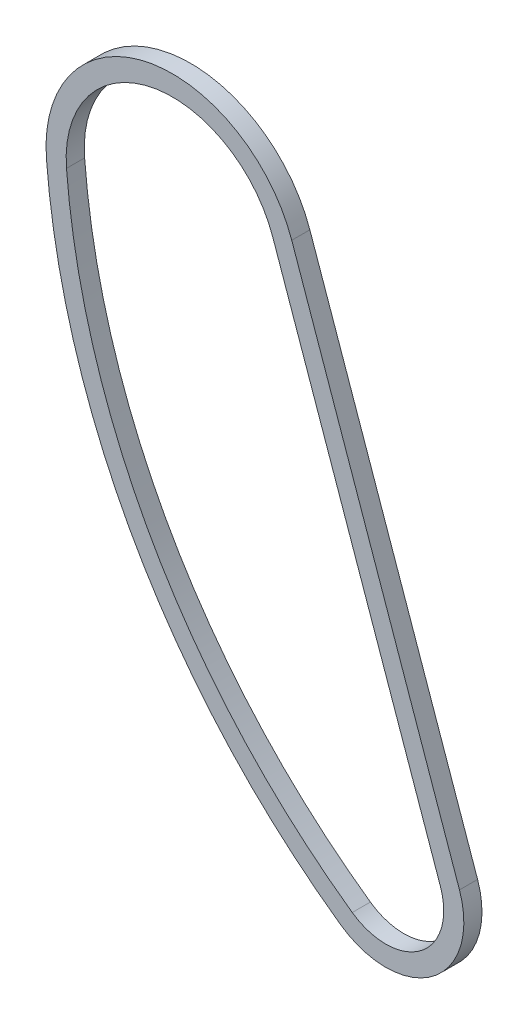
ISO-10303-21;
HEADER;
FILE_DESCRIPTION(('STEP AP214'),'2;1');
FILE_NAME('part.step','',(''),(''),'','','');
FILE_SCHEMA(('AUTOMOTIVE_DESIGN { 1 0 10303 214 1 1 1 1 }'));
ENDSEC;
DATA;
#1=APPLICATION_CONTEXT('core data for automotive mechanical design processes');
#2=APPLICATION_PROTOCOL_DEFINITION('international standard','automotive_design',2000,#1);
#3=PRODUCT_CONTEXT('',#1,'mechanical');
#4=PRODUCT('Part','Part','',(#3));
#5=PRODUCT_RELATED_PRODUCT_CATEGORY('part','',(#4));
#6=PRODUCT_DEFINITION_FORMATION('','',#4);
#7=PRODUCT_DEFINITION_CONTEXT('part definition',#1,'design');
#8=PRODUCT_DEFINITION('design','',#6,#7);
#9=PRODUCT_DEFINITION_SHAPE('','',#8);
#10=(LENGTH_UNIT() NAMED_UNIT(*) SI_UNIT(.MILLI.,.METRE.));
#11=(NAMED_UNIT(*) PLANE_ANGLE_UNIT() SI_UNIT($,.RADIAN.));
#12=(NAMED_UNIT(*) SI_UNIT($,.STERADIAN.) SOLID_ANGLE_UNIT());
#13=UNCERTAINTY_MEASURE_WITH_UNIT(LENGTH_MEASURE(1.E-05),#10,'distance_accuracy_value','');
#14=(GEOMETRIC_REPRESENTATION_CONTEXT(3) GLOBAL_UNCERTAINTY_ASSIGNED_CONTEXT((#13)) GLOBAL_UNIT_ASSIGNED_CONTEXT((#10,
#11,#12)) REPRESENTATION_CONTEXT('',''));
#15=CARTESIAN_POINT('',(0.,0.,0.));
#16=DIRECTION('',(0.,0.,1.));
#17=DIRECTION('',(1.,0.,0.));
#18=AXIS2_PLACEMENT_3D('',#15,#16,#17);
#19=CARTESIAN_POINT('',(0.,0.,4.5));
#20=DIRECTION('',(0.,0.,1.));
#21=DIRECTION('',(1.,0.,0.));
#22=AXIS2_PLACEMENT_3D('',#19,#20,#21);
#23=PLANE('',#22);
#24=CARTESIAN_POINT('',(0.,0.,4.5));
#25=DIRECTION('',(0.,0.,1.));
#26=DIRECTION('',(1.,0.,0.));
#27=AXIS2_PLACEMENT_3D('',#24,#25,#26);
#28=CIRCLE('',#27,31.41);
#29=CARTESIAN_POINT('',(29.6432303289157,10.3859037000568,4.5));
#30=VERTEX_POINT('',#29);
#31=CARTESIAN_POINT('',(-31.3082990590125,-2.52557122873938,4.5));
#32=VERTEX_POINT('',#31);
#33=EDGE_CURVE('E143',#30,#32,#28,.T.);
#34=ORIENTED_EDGE('',*,*,#33,.T.);
#35=CARTESIAN_POINT('',(142.434706000974,11.4898926566395,4.5));
#36=DIRECTION('',(0.,0.,1.));
#37=DIRECTION('',(1.,0.,0.));
#38=AXIS2_PLACEMENT_3D('',#35,#36,#37);
#39=CIRCLE('',#38,174.307386634064);
#40=CARTESIAN_POINT('',(41.7930475703897,-130.827785878174,4.5));
#41=VERTEX_POINT('',#40);
#42=EDGE_CURVE('E150',#32,#41,#39,.T.);
#43=ORIENTED_EDGE('',*,*,#42,.T.);
#44=CARTESIAN_POINT('',(53.,-114.98,4.5));
#45=DIRECTION('',(0.,0.,1.));
#46=DIRECTION('',(1.,0.,0.));
#47=AXIS2_PLACEMENT_3D('',#44,#45,#46);
#48=CIRCLE('',#47,19.41);
#49=CARTESIAN_POINT('',(71.3182139663882,-108.56196781859,4.5));
#50=VERTEX_POINT('',#49);
#51=EDGE_CURVE('E148',#41,#50,#48,.T.);
#52=ORIENTED_EDGE('',*,*,#51,.T.);
#53=DIRECTION('',(-0.330655959887195,0.943751363543957,0.));
#54=VECTOR('',#53,1.);
#55=CARTESIAN_POINT('',(71.3182139663882,-108.56196781859,4.5));
#56=LINE('',#55,#54);
#57=EDGE_CURVE('E155',#50,#30,#56,.T.);
#58=ORIENTED_EDGE('',*,*,#57,.T.);
#59=EDGE_LOOP('',(#34,#43,#52,#58));
#60=FACE_BOUND('',#59,.T.);
#61=CARTESIAN_POINT('',(142.434706000974,11.4898926566395,4.5));
#62=DIRECTION('',(0.,0.,1.));
#63=DIRECTION('',(1.,0.,0.));
#64=AXIS2_PLACEMENT_3D('',#61,#62,#63);
#65=CIRCLE('',#64,169.307386634064);
#66=CARTESIAN_POINT('',(-26.3244883205514,-2.1235382410381,4.5));
#67=VERTEX_POINT('',#66);
#68=CARTESIAN_POINT('',(44.6799492781718,-126.745409299561,4.5));
#69=VERTEX_POINT('',#68);
#70=EDGE_CURVE('E117',#67,#69,#65,.T.);
#71=ORIENTED_EDGE('',*,*,#70,.F.);
#72=CARTESIAN_POINT('',(0.,0.,4.5));
#73=DIRECTION('',(0.,0.,1.));
#74=DIRECTION('',(1.,0.,0.));
#75=AXIS2_PLACEMENT_3D('',#72,#73,#74);
#76=CIRCLE('',#75,26.41);
#77=CARTESIAN_POINT('',(24.9244735111959,8.73262390062083,4.5));
#78=VERTEX_POINT('',#77);
#79=EDGE_CURVE('E108',#78,#67,#76,.T.);
#80=ORIENTED_EDGE('',*,*,#79,.F.);
#81=DIRECTION('',(-0.330655959887195,0.943751363543957,0.));
#82=VECTOR('',#81,1.);
#83=CARTESIAN_POINT('',(66.5994571486684,-110.215247618026,4.5));
#84=LINE('',#83,#82);
#85=CARTESIAN_POINT('',(66.5994571486684,-110.215247618026,4.5));
#86=VERTEX_POINT('',#85);
#87=EDGE_CURVE('E127',#86,#78,#84,.T.);
#88=ORIENTED_EDGE('',*,*,#87,.F.);
#89=CARTESIAN_POINT('',(53.,-114.98,4.5));
#90=DIRECTION('',(0.,0.,1.));
#91=DIRECTION('',(1.,0.,0.));
#92=AXIS2_PLACEMENT_3D('',#89,#90,#91);
#93=CIRCLE('',#92,14.41);
#94=EDGE_CURVE('E126',#69,#86,#93,.T.);
#95=ORIENTED_EDGE('',*,*,#94,.F.);
#96=EDGE_LOOP('',(#71,#80,#88,#95));
#97=FACE_BOUND('',#96,.T.);
#98=ADVANCED_FACE('F43',(#60,#97),#23,.T.);
#99=CARTESIAN_POINT('',(0.,0.,0.));
#100=DIRECTION('',(0.,0.,1.));
#101=DIRECTION('',(1.,0.,0.));
#102=AXIS2_PLACEMENT_3D('',#99,#100,#101);
#103=PLANE('',#102);
#104=CARTESIAN_POINT('',(0.,0.,0.));
#105=DIRECTION('',(0.,0.,1.));
#106=DIRECTION('',(1.,0.,0.));
#107=AXIS2_PLACEMENT_3D('',#104,#105,#106);
#108=CIRCLE('',#107,31.41);
#109=CARTESIAN_POINT('',(29.6432303289157,10.3859037000568,0.));
#110=VERTEX_POINT('',#109);
#111=CARTESIAN_POINT('',(-31.3082990590125,-2.52557122873938,0.));
#112=VERTEX_POINT('',#111);
#113=EDGE_CURVE('E125',#110,#112,#108,.T.);
#114=ORIENTED_EDGE('',*,*,#113,.F.);
#115=DIRECTION('',(-0.330655959887195,0.943751363543957,0.));
#116=VECTOR('',#115,1.);
#117=CARTESIAN_POINT('',(71.3182139663882,-108.56196781859,0.));
#118=LINE('',#117,#116);
#119=CARTESIAN_POINT('',(71.3182139663882,-108.56196781859,0.));
#120=VERTEX_POINT('',#119);
#121=EDGE_CURVE('E149',#120,#110,#118,.T.);
#122=ORIENTED_EDGE('',*,*,#121,.F.);
#123=CARTESIAN_POINT('',(53.,-114.98,0.));
#124=DIRECTION('',(0.,0.,1.));
#125=DIRECTION('',(1.,0.,0.));
#126=AXIS2_PLACEMENT_3D('',#123,#124,#125);
#127=CIRCLE('',#126,19.41);
#128=CARTESIAN_POINT('',(41.7930475703897,-130.827785878174,0.));
#129=VERTEX_POINT('',#128);
#130=EDGE_CURVE('E159',#129,#120,#127,.T.);
#131=ORIENTED_EDGE('',*,*,#130,.F.);
#132=CARTESIAN_POINT('',(142.434706000974,11.4898926566395,0.));
#133=DIRECTION('',(0.,0.,1.));
#134=DIRECTION('',(1.,0.,0.));
#135=AXIS2_PLACEMENT_3D('',#132,#133,#134);
#136=CIRCLE('',#135,174.307386634064);
#137=EDGE_CURVE('E160',#112,#129,#136,.T.);
#138=ORIENTED_EDGE('',*,*,#137,.F.);
#139=EDGE_LOOP('',(#114,#122,#131,#138));
#140=FACE_BOUND('',#139,.T.);
#141=CARTESIAN_POINT('',(0.,0.,0.));
#142=DIRECTION('',(0.,0.,1.));
#143=DIRECTION('',(1.,0.,0.));
#144=AXIS2_PLACEMENT_3D('',#141,#142,#143);
#145=CIRCLE('',#144,26.41);
#146=CARTESIAN_POINT('',(24.9244735111959,8.73262390062083,0.));
#147=VERTEX_POINT('',#146);
#148=CARTESIAN_POINT('',(-26.3244883205514,-2.1235382410381,0.));
#149=VERTEX_POINT('',#148);
#150=EDGE_CURVE('E67',#147,#149,#145,.T.);
#151=ORIENTED_EDGE('',*,*,#150,.T.);
#152=CARTESIAN_POINT('',(142.434706000974,11.4898926566395,0.));
#153=DIRECTION('',(0.,0.,1.));
#154=DIRECTION('',(1.,0.,0.));
#155=AXIS2_PLACEMENT_3D('',#152,#153,#154);
#156=CIRCLE('',#155,169.307386634064);
#157=CARTESIAN_POINT('',(44.6799492781718,-126.745409299561,0.));
#158=VERTEX_POINT('',#157);
#159=EDGE_CURVE('E121',#149,#158,#156,.T.);
#160=ORIENTED_EDGE('',*,*,#159,.T.);
#161=CARTESIAN_POINT('',(53.,-114.98,0.));
#162=DIRECTION('',(0.,0.,1.));
#163=DIRECTION('',(1.,0.,0.));
#164=AXIS2_PLACEMENT_3D('',#161,#162,#163);
#165=CIRCLE('',#164,14.41);
#166=CARTESIAN_POINT('',(66.5994571486684,-110.215247618026,0.));
#167=VERTEX_POINT('',#166);
#168=EDGE_CURVE('E136',#158,#167,#165,.T.);
#169=ORIENTED_EDGE('',*,*,#168,.T.);
#170=DIRECTION('',(-0.330655959887195,0.943751363543957,0.));
#171=VECTOR('',#170,1.);
#172=CARTESIAN_POINT('',(66.5994571486684,-110.215247618026,0.));
#173=LINE('',#172,#171);
#174=EDGE_CURVE('E120',#167,#147,#173,.T.);
#175=ORIENTED_EDGE('',*,*,#174,.T.);
#176=EDGE_LOOP('',(#151,#160,#169,#175));
#177=FACE_BOUND('',#176,.T.);
#178=ADVANCED_FACE('F180',(#140,#177),#103,.F.);
#179=CARTESIAN_POINT('',(0.,0.,4.5));
#180=DIRECTION('',(0.,0.,-1.));
#181=DIRECTION('',(-1.,0.,0.));
#182=AXIS2_PLACEMENT_3D('',#179,#180,#181);
#183=CYLINDRICAL_SURFACE('',#182,31.41);
#184=ORIENTED_EDGE('',*,*,#113,.T.);
#185=DIRECTION('',(0.,0.,-1.));
#186=VECTOR('',#185,1.);
#187=CARTESIAN_POINT('',(-31.3082990590125,-2.52557122873938,4.5));
#188=LINE('',#187,#186);
#189=EDGE_CURVE('E11',#32,#112,#188,.T.);
#190=ORIENTED_EDGE('',*,*,#189,.F.);
#191=ORIENTED_EDGE('',*,*,#33,.F.);
#192=DIRECTION('',(0.,0.,-1.));
#193=VECTOR('',#192,1.);
#194=CARTESIAN_POINT('',(29.6432303289157,10.3859037000568,4.5));
#195=LINE('',#194,#193);
#196=EDGE_CURVE('E154',#30,#110,#195,.T.);
#197=ORIENTED_EDGE('',*,*,#196,.T.);
#198=EDGE_LOOP('',(#184,#190,#191,#197));
#199=FACE_BOUND('',#198,.T.);
#200=ADVANCED_FACE('F44',(#199),#183,.T.);
#201=CARTESIAN_POINT('',(142.434706000974,11.4898926566395,4.5));
#202=DIRECTION('',(0.,0.,-1.));
#203=DIRECTION('',(-1.,0.,0.));
#204=AXIS2_PLACEMENT_3D('',#201,#202,#203);
#205=CYLINDRICAL_SURFACE('',#204,174.307386634064);
#206=ORIENTED_EDGE('',*,*,#137,.T.);
#207=DIRECTION('',(0.,0.,-1.));
#208=VECTOR('',#207,1.);
#209=CARTESIAN_POINT('',(41.7930475703897,-130.827785878174,4.5));
#210=LINE('',#209,#208);
#211=EDGE_CURVE('E51',#41,#129,#210,.T.);
#212=ORIENTED_EDGE('',*,*,#211,.F.);
#213=ORIENTED_EDGE('',*,*,#42,.F.);
#214=ORIENTED_EDGE('',*,*,#189,.T.);
#215=EDGE_LOOP('',(#206,#212,#213,#214));
#216=FACE_BOUND('',#215,.T.);
#217=ADVANCED_FACE('F190',(#216),#205,.T.);
#218=CARTESIAN_POINT('',(53.,-114.98,4.5));
#219=DIRECTION('',(0.,0.,-1.));
#220=DIRECTION('',(-1.,0.,0.));
#221=AXIS2_PLACEMENT_3D('',#218,#219,#220);
#222=CYLINDRICAL_SURFACE('',#221,19.41);
#223=ORIENTED_EDGE('',*,*,#130,.T.);
#224=DIRECTION('',(0.,0.,-1.));
#225=VECTOR('',#224,1.);
#226=CARTESIAN_POINT('',(71.3182139663882,-108.56196781859,4.5));
#227=LINE('',#226,#225);
#228=EDGE_CURVE('E164',#50,#120,#227,.T.);
#229=ORIENTED_EDGE('',*,*,#228,.F.);
#230=ORIENTED_EDGE('',*,*,#51,.F.);
#231=ORIENTED_EDGE('',*,*,#211,.T.);
#232=EDGE_LOOP('',(#223,#229,#230,#231));
#233=FACE_BOUND('',#232,.T.);
#234=ADVANCED_FACE('F173',(#233),#222,.T.);
#235=CARTESIAN_POINT('',(71.3182139663882,-108.56196781859,4.5));
#236=DIRECTION('',(-0.943751363543957,-0.330655959887195,0.));
#237=DIRECTION('',(0.330655959887195,-0.943751363543957,0.));
#238=AXIS2_PLACEMENT_3D('',#235,#236,#237);
#239=PLANE('',#238);
#240=ORIENTED_EDGE('',*,*,#121,.T.);
#241=ORIENTED_EDGE('',*,*,#196,.F.);
#242=ORIENTED_EDGE('',*,*,#57,.F.);
#243=ORIENTED_EDGE('',*,*,#228,.T.);
#244=EDGE_LOOP('',(#240,#241,#242,#243));
#245=FACE_BOUND('',#244,.T.);
#246=ADVANCED_FACE('F181',(#245),#239,.F.);
#247=CARTESIAN_POINT('',(0.,0.,4.5));
#248=DIRECTION('',(0.,0.,-1.));
#249=DIRECTION('',(-1.,0.,0.));
#250=AXIS2_PLACEMENT_3D('',#247,#248,#249);
#251=CYLINDRICAL_SURFACE('',#250,26.41);
#252=ORIENTED_EDGE('',*,*,#150,.F.);
#253=DIRECTION('',(0.,0.,-1.));
#254=VECTOR('',#253,1.);
#255=CARTESIAN_POINT('',(24.9244735111959,8.73262390062083,4.5));
#256=LINE('',#255,#254);
#257=EDGE_CURVE('E115',#78,#147,#256,.T.);
#258=ORIENTED_EDGE('',*,*,#257,.F.);
#259=ORIENTED_EDGE('',*,*,#79,.T.);
#260=DIRECTION('',(0.,0.,-1.));
#261=VECTOR('',#260,1.);
#262=CARTESIAN_POINT('',(-26.3244883205514,-2.1235382410381,4.5));
#263=LINE('',#262,#261);
#264=EDGE_CURVE('E112',#67,#149,#263,.T.);
#265=ORIENTED_EDGE('',*,*,#264,.T.);
#266=EDGE_LOOP('',(#252,#258,#259,#265));
#267=FACE_BOUND('',#266,.T.);
#268=ADVANCED_FACE('F106',(#267),#251,.F.);
#269=CARTESIAN_POINT('',(142.434706000974,11.4898926566395,4.5));
#270=DIRECTION('',(0.,0.,-1.));
#271=DIRECTION('',(-1.,0.,0.));
#272=AXIS2_PLACEMENT_3D('',#269,#270,#271);
#273=CYLINDRICAL_SURFACE('',#272,169.307386634064);
#274=ORIENTED_EDGE('',*,*,#159,.F.);
#275=ORIENTED_EDGE('',*,*,#264,.F.);
#276=ORIENTED_EDGE('',*,*,#70,.T.);
#277=DIRECTION('',(0.,0.,-1.));
#278=VECTOR('',#277,1.);
#279=CARTESIAN_POINT('',(44.6799492781718,-126.745409299561,4.5));
#280=LINE('',#279,#278);
#281=EDGE_CURVE('E124',#69,#158,#280,.T.);
#282=ORIENTED_EDGE('',*,*,#281,.T.);
#283=EDGE_LOOP('',(#274,#275,#276,#282));
#284=FACE_BOUND('',#283,.T.);
#285=ADVANCED_FACE('F116',(#284),#273,.F.);
#286=CARTESIAN_POINT('',(53.,-114.98,4.5));
#287=DIRECTION('',(0.,0.,-1.));
#288=DIRECTION('',(-1.,0.,0.));
#289=AXIS2_PLACEMENT_3D('',#286,#287,#288);
#290=CYLINDRICAL_SURFACE('',#289,14.41);
#291=ORIENTED_EDGE('',*,*,#168,.F.);
#292=ORIENTED_EDGE('',*,*,#281,.F.);
#293=ORIENTED_EDGE('',*,*,#94,.T.);
#294=DIRECTION('',(0.,0.,-1.));
#295=VECTOR('',#294,1.);
#296=CARTESIAN_POINT('',(66.5994571486684,-110.215247618026,4.5));
#297=LINE('',#296,#295);
#298=EDGE_CURVE('E59',#86,#167,#297,.T.);
#299=ORIENTED_EDGE('',*,*,#298,.T.);
#300=EDGE_LOOP('',(#291,#292,#293,#299));
#301=FACE_BOUND('',#300,.T.);
#302=ADVANCED_FACE('F206',(#301),#290,.F.);
#303=CARTESIAN_POINT('',(66.5994571486684,-110.215247618026,4.5));
#304=DIRECTION('',(-0.943751363543957,-0.330655959887195,0.));
#305=DIRECTION('',(0.330655959887195,-0.943751363543957,0.));
#306=AXIS2_PLACEMENT_3D('',#303,#304,#305);
#307=PLANE('',#306);
#308=ORIENTED_EDGE('',*,*,#174,.F.);
#309=ORIENTED_EDGE('',*,*,#298,.F.);
#310=ORIENTED_EDGE('',*,*,#87,.T.);
#311=ORIENTED_EDGE('',*,*,#257,.T.);
#312=EDGE_LOOP('',(#308,#309,#310,#311));
#313=FACE_BOUND('',#312,.T.);
#314=ADVANCED_FACE('F215',(#313),#307,.T.);
#315=CLOSED_SHELL('',(#98,#178,#200,#217,#234,#246,#268,#285,#302,#314));
#316=MANIFOLD_SOLID_BREP('B2',#315);
#317=ADVANCED_BREP_SHAPE_REPRESENTATION('',(#18,#316),#14);
#318=SHAPE_DEFINITION_REPRESENTATION(#9,#317);
ENDSEC;
END-ISO-10303-21;
